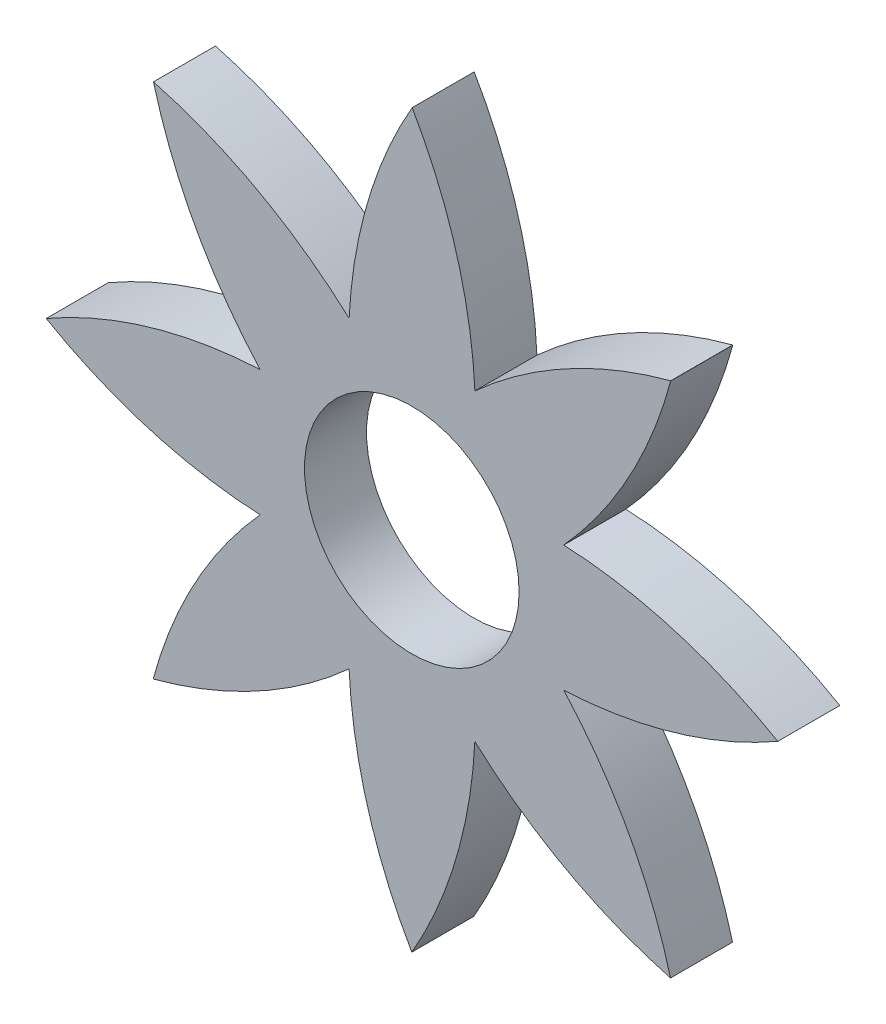
ISO-10303-21;
HEADER;
FILE_DESCRIPTION(('STEP AP214'),'2;1');
FILE_NAME('part.step','',(''),(''),'','','');
FILE_SCHEMA(('AUTOMOTIVE_DESIGN { 1 0 10303 214 1 1 1 1 }'));
ENDSEC;
DATA;
#1=APPLICATION_CONTEXT('core data for automotive mechanical design processes');
#2=APPLICATION_PROTOCOL_DEFINITION('international standard','automotive_design',2000,#1);
#3=PRODUCT_CONTEXT('',#1,'mechanical');
#4=PRODUCT('Part','Part','',(#3));
#5=PRODUCT_RELATED_PRODUCT_CATEGORY('part','',(#4));
#6=PRODUCT_DEFINITION_FORMATION('','',#4);
#7=PRODUCT_DEFINITION_CONTEXT('part definition',#1,'design');
#8=PRODUCT_DEFINITION('design','',#6,#7);
#9=PRODUCT_DEFINITION_SHAPE('','',#8);
#10=(LENGTH_UNIT() NAMED_UNIT(*) SI_UNIT(.MILLI.,.METRE.));
#11=(NAMED_UNIT(*) PLANE_ANGLE_UNIT() SI_UNIT($,.RADIAN.));
#12=(NAMED_UNIT(*) SI_UNIT($,.STERADIAN.) SOLID_ANGLE_UNIT());
#13=UNCERTAINTY_MEASURE_WITH_UNIT(LENGTH_MEASURE(1.E-05),#10,'distance_accuracy_value','');
#14=(GEOMETRIC_REPRESENTATION_CONTEXT(3) GLOBAL_UNCERTAINTY_ASSIGNED_CONTEXT((#13)) GLOBAL_UNIT_ASSIGNED_CONTEXT((#10,
#11,#12)) REPRESENTATION_CONTEXT('',''));
#15=CARTESIAN_POINT('',(0.,0.,0.));
#16=DIRECTION('',(0.,0.,1.));
#17=DIRECTION('',(1.,0.,0.));
#18=AXIS2_PLACEMENT_3D('',#15,#16,#17);
#19=CARTESIAN_POINT('',(13.1836756550632,-42.0143777364416,6.35));
#20=DIRECTION('',(0.,0.,-1.));
#21=DIRECTION('',(-1.,0.,0.));
#22=AXIS2_PLACEMENT_3D('',#19,#20,#21);
#23=CYLINDRICAL_SURFACE('',#22,48.5261851841294);
#24=CARTESIAN_POINT('',(13.1836756550632,-42.0143777364416,0.));
#25=DIRECTION('',(0.,0.,1.));
#26=DIRECTION('',(1.,0.,0.));
#27=AXIS2_PLACEMENT_3D('',#24,#25,#26);
#28=CIRCLE('',#27,48.5261851841294);
#29=CARTESIAN_POINT('',(15.5602905844267,6.45357404617399,0.));
#30=VERTEX_POINT('',#29);
#31=CARTESIAN_POINT('',(37.465,0.,0.));
#32=VERTEX_POINT('',#31);
#33=EDGE_CURVE('E192',#30,#32,#28,.F.);
#34=ORIENTED_EDGE('',*,*,#33,.F.);
#35=DIRECTION('',(0.,0.,-1.));
#36=VECTOR('',#35,1.);
#37=CARTESIAN_POINT('',(15.5602905844267,6.45357404617399,6.35));
#38=LINE('',#37,#36);
#39=CARTESIAN_POINT('',(15.5602905844267,6.45357404617399,6.35));
#40=VERTEX_POINT('',#39);
#41=EDGE_CURVE('E11',#40,#30,#38,.T.);
#42=ORIENTED_EDGE('',*,*,#41,.F.);
#43=CARTESIAN_POINT('',(13.1836756550632,-42.0143777364416,6.35));
#44=DIRECTION('',(0.,0.,1.));
#45=DIRECTION('',(1.,0.,0.));
#46=AXIS2_PLACEMENT_3D('',#43,#44,#45);
#47=CIRCLE('',#46,48.5261851841294);
#48=CARTESIAN_POINT('',(37.465,0.,6.35));
#49=VERTEX_POINT('',#48);
#50=EDGE_CURVE('E345',#40,#49,#47,.F.);
#51=ORIENTED_EDGE('',*,*,#50,.T.);
#52=DIRECTION('',(0.,0.,-1.));
#53=VECTOR('',#52,1.);
#54=CARTESIAN_POINT('',(37.465,0.,6.35));
#55=LINE('',#54,#53);
#56=EDGE_CURVE('E119',#49,#32,#55,.T.);
#57=ORIENTED_EDGE('',*,*,#56,.T.);
#58=EDGE_LOOP('',(#34,#42,#51,#57));
#59=FACE_BOUND('',#58,.T.);
#60=ADVANCED_FACE('F41',(#59),#23,.T.);
#61=CARTESIAN_POINT('',(-20.3470310174331,39.0948807587588,6.35));
#62=DIRECTION('',(0.,0.,-1.));
#63=DIRECTION('',(-1.,0.,0.));
#64=AXIS2_PLACEMENT_3D('',#61,#62,#63);
#65=CYLINDRICAL_SURFACE('',#64,48.5261851841295);
#66=CARTESIAN_POINT('',(-20.3470310174331,39.0948807587588,0.));
#67=DIRECTION('',(0.,0.,1.));
#68=DIRECTION('',(1.,0.,0.));
#69=AXIS2_PLACEMENT_3D('',#66,#67,#68);
#70=CIRCLE('',#69,48.5261851841295);
#71=CARTESIAN_POINT('',(26.5092436609007,26.4742559012901,0.));
#72=VERTEX_POINT('',#71);
#73=EDGE_CURVE('E195',#30,#72,#70,.T.);
#74=ORIENTED_EDGE('',*,*,#73,.T.);
#75=DIRECTION('',(0.,0.,-1.));
#76=VECTOR('',#75,1.);
#77=CARTESIAN_POINT('',(26.5092436609007,26.4742559012901,6.35));
#78=LINE('',#77,#76);
#79=CARTESIAN_POINT('',(26.5092436609007,26.4742559012901,6.35));
#80=VERTEX_POINT('',#79);
#81=EDGE_CURVE('E50',#80,#72,#78,.T.);
#82=ORIENTED_EDGE('',*,*,#81,.F.);
#83=CARTESIAN_POINT('',(-20.3470310174331,39.0948807587588,6.35));
#84=DIRECTION('',(0.,0.,1.));
#85=DIRECTION('',(1.,0.,0.));
#86=AXIS2_PLACEMENT_3D('',#83,#84,#85);
#87=CIRCLE('',#86,48.5261851841295);
#88=EDGE_CURVE('E347',#40,#80,#87,.T.);
#89=ORIENTED_EDGE('',*,*,#88,.F.);
#90=ORIENTED_EDGE('',*,*,#41,.T.);
#91=EDGE_LOOP('',(#74,#82,#89,#90));
#92=FACE_BOUND('',#91,.T.);
#93=ADVANCED_FACE('F273',(#92),#65,.T.);
#94=CARTESIAN_POINT('',(0.,0.,6.35));
#95=DIRECTION('',(0.,0.,-1.));
#96=DIRECTION('',(-1.,0.,0.));
#97=AXIS2_PLACEMENT_3D('',#94,#95,#96);
#98=CYLINDRICAL_SURFACE('',#97,37.465);
#99=CARTESIAN_POINT('',(0.,0.,0.));
#100=DIRECTION('',(0.,0.,1.));
#101=DIRECTION('',(1.,0.,0.));
#102=AXIS2_PLACEMENT_3D('',#99,#100,#101);
#103=CIRCLE('',#102,37.465);
#104=CARTESIAN_POINT('',(26.5025029388673,26.4810038135892,0.));
#105=VERTEX_POINT('',#104);
#106=EDGE_CURVE('E198',#72,#105,#103,.T.);
#107=ORIENTED_EDGE('',*,*,#106,.T.);
#108=DIRECTION('',(0.,0.,-1.));
#109=VECTOR('',#108,1.);
#110=CARTESIAN_POINT('',(26.5025029388673,26.4810038135892,6.35));
#111=LINE('',#110,#109);
#112=CARTESIAN_POINT('',(26.5025029388673,26.4810038135892,6.35));
#113=VERTEX_POINT('',#112);
#114=EDGE_CURVE('E263',#113,#105,#111,.T.);
#115=ORIENTED_EDGE('',*,*,#114,.F.);
#116=CARTESIAN_POINT('',(0.,0.,6.35));
#117=DIRECTION('',(0.,0.,1.));
#118=DIRECTION('',(1.,0.,0.));
#119=AXIS2_PLACEMENT_3D('',#116,#117,#118);
#120=CIRCLE('',#119,37.465);
#121=EDGE_CURVE('E269',#80,#113,#120,.T.);
#122=ORIENTED_EDGE('',*,*,#121,.F.);
#123=ORIENTED_EDGE('',*,*,#81,.T.);
#124=EDGE_LOOP('',(#107,#115,#122,#123));
#125=FACE_BOUND('',#124,.T.);
#126=ADVANCED_FACE('F267',(#125),#98,.T.);
#127=CARTESIAN_POINT('',(39.0508871958942,-20.3946689929148,6.35));
#128=DIRECTION('',(0.,0.,-1.));
#129=DIRECTION('',(-1.,0.,0.));
#130=AXIS2_PLACEMENT_3D('',#127,#128,#129);
#131=CYLINDRICAL_SURFACE('',#130,48.5261851841294);
#132=CARTESIAN_POINT('',(39.0508871958942,-20.3946689929148,0.));
#133=DIRECTION('',(0.,0.,1.));
#134=DIRECTION('',(1.,0.,0.));
#135=AXIS2_PLACEMENT_3D('',#132,#133,#134);
#136=CIRCLE('',#135,48.5261851841294);
#137=CARTESIAN_POINT('',(6.45939035300629,15.5578689156175,0.));
#138=VERTEX_POINT('',#137);
#139=EDGE_CURVE('E201',#138,#105,#136,.F.);
#140=ORIENTED_EDGE('',*,*,#139,.F.);
#141=DIRECTION('',(0.,0.,-1.));
#142=VECTOR('',#141,1.);
#143=CARTESIAN_POINT('',(6.45939035300629,15.5578689156175,6.35));
#144=LINE('',#143,#142);
#145=CARTESIAN_POINT('',(6.45939035300629,15.5578689156175,6.35));
#146=VERTEX_POINT('',#145);
#147=EDGE_CURVE('E261',#146,#138,#144,.T.);
#148=ORIENTED_EDGE('',*,*,#147,.F.);
#149=CARTESIAN_POINT('',(39.0508871958942,-20.3946689929148,6.35));
#150=DIRECTION('',(0.,0.,1.));
#151=DIRECTION('',(1.,0.,0.));
#152=AXIS2_PLACEMENT_3D('',#149,#150,#151);
#153=CIRCLE('',#152,48.5261851841294);
#154=EDGE_CURVE('E352',#146,#113,#153,.F.);
#155=ORIENTED_EDGE('',*,*,#154,.T.);
#156=ORIENTED_EDGE('',*,*,#114,.T.);
#157=EDGE_LOOP('',(#140,#148,#155,#156));
#158=FACE_BOUND('',#157,.T.);
#159=ADVANCED_FACE('F284',(#158),#131,.T.);
#160=CARTESIAN_POINT('',(-42.0118095691737,13.2484476399549,6.35));
#161=DIRECTION('',(0.,0.,-1.));
#162=DIRECTION('',(-1.,0.,0.));
#163=AXIS2_PLACEMENT_3D('',#160,#161,#162);
#164=CYLINDRICAL_SURFACE('',#163,48.5261851841295);
#165=CARTESIAN_POINT('',(-42.0118095691737,13.2484476399549,0.));
#166=DIRECTION('',(0.,0.,1.));
#167=DIRECTION('',(1.,0.,0.));
#168=AXIS2_PLACEMENT_3D('',#165,#166,#167);
#169=CIRCLE('',#168,48.5261851841295);
#170=CARTESIAN_POINT('',(0.0399474905353088,37.4649787027565,0.));
#171=VERTEX_POINT('',#170);
#172=EDGE_CURVE('E204',#138,#171,#169,.T.);
#173=ORIENTED_EDGE('',*,*,#172,.T.);
#174=DIRECTION('',(0.,0.,-1.));
#175=VECTOR('',#174,1.);
#176=CARTESIAN_POINT('',(0.0399474905353088,37.4649787027565,6.35));
#177=LINE('',#176,#175);
#178=CARTESIAN_POINT('',(0.0399474905353088,37.4649787027565,6.35));
#179=VERTEX_POINT('',#178);
#180=EDGE_CURVE('E259',#179,#171,#177,.T.);
#181=ORIENTED_EDGE('',*,*,#180,.F.);
#182=CARTESIAN_POINT('',(-42.0118095691737,13.2484476399549,6.35));
#183=DIRECTION('',(0.,0.,1.));
#184=DIRECTION('',(1.,0.,0.));
#185=AXIS2_PLACEMENT_3D('',#182,#183,#184);
#186=CIRCLE('',#185,48.5261851841295);
#187=EDGE_CURVE('E355',#146,#179,#186,.T.);
#188=ORIENTED_EDGE('',*,*,#187,.F.);
#189=ORIENTED_EDGE('',*,*,#147,.T.);
#190=EDGE_LOOP('',(#173,#181,#188,#189));
#191=FACE_BOUND('',#190,.T.);
#192=ADVANCED_FACE('F287',(#191),#164,.T.);
#193=CARTESIAN_POINT('',(42.0543252269769,13.1836543578197,6.35));
#194=DIRECTION('',(0.,0.,-1.));
#195=DIRECTION('',(-1.,0.,0.));
#196=AXIS2_PLACEMENT_3D('',#193,#194,#195);
#197=CYLINDRICAL_SURFACE('',#196,48.5261851841294);
#198=CARTESIAN_POINT('',(42.0543252269769,13.1836543578197,0.));
#199=DIRECTION('',(0.,0.,1.));
#200=DIRECTION('',(1.,0.,0.));
#201=AXIS2_PLACEMENT_3D('',#198,#199,#200);
#202=CIRCLE('',#201,48.5261851841294);
#203=CARTESIAN_POINT('',(-6.41362655563869,15.5602692871832,0.));
#204=VERTEX_POINT('',#203);
#205=EDGE_CURVE('E207',#204,#171,#202,.F.);
#206=ORIENTED_EDGE('',*,*,#205,.F.);
#207=DIRECTION('',(0.,0.,-1.));
#208=VECTOR('',#207,1.);
#209=CARTESIAN_POINT('',(-6.41362655563869,15.5602692871832,6.35));
#210=LINE('',#209,#208);
#211=CARTESIAN_POINT('',(-6.41362655563869,15.5602692871832,6.35));
#212=VERTEX_POINT('',#211);
#213=EDGE_CURVE('E257',#212,#204,#210,.T.);
#214=ORIENTED_EDGE('',*,*,#213,.F.);
#215=CARTESIAN_POINT('',(42.0543252269769,13.1836543578197,6.35));
#216=DIRECTION('',(0.,0.,1.));
#217=DIRECTION('',(1.,0.,0.));
#218=AXIS2_PLACEMENT_3D('',#215,#216,#217);
#219=CIRCLE('',#218,48.5261851841294);
#220=EDGE_CURVE('E357',#212,#179,#219,.F.);
#221=ORIENTED_EDGE('',*,*,#220,.T.);
#222=ORIENTED_EDGE('',*,*,#180,.T.);
#223=EDGE_LOOP('',(#206,#214,#221,#222));
#224=FACE_BOUND('',#223,.T.);
#225=ADVANCED_FACE('F291',(#224),#197,.T.);
#226=CARTESIAN_POINT('',(-39.0549332682235,-20.3470523146766,6.35));
#227=DIRECTION('',(0.,0.,-1.));
#228=DIRECTION('',(-1.,0.,0.));
#229=AXIS2_PLACEMENT_3D('',#226,#227,#228);
#230=CYLINDRICAL_SURFACE('',#229,48.5261851841295);
#231=CARTESIAN_POINT('',(-39.0549332682235,-20.3470523146766,0.));
#232=DIRECTION('',(0.,0.,1.));
#233=DIRECTION('',(1.,0.,0.));
#234=AXIS2_PLACEMENT_3D('',#231,#232,#233);
#235=CIRCLE('',#234,48.5261851841295);
#236=CARTESIAN_POINT('',(-26.4435240218157,26.5117035943746,0.));
#237=VERTEX_POINT('',#236);
#238=EDGE_CURVE('E210',#204,#237,#235,.T.);
#239=ORIENTED_EDGE('',*,*,#238,.T.);
#240=DIRECTION('',(0.,0.,-1.));
#241=VECTOR('',#240,1.);
#242=CARTESIAN_POINT('',(-26.4435240218157,26.5117035943746,6.35));
#243=LINE('',#242,#241);
#244=CARTESIAN_POINT('',(-26.4435240218157,26.5117035943746,6.35));
#245=VERTEX_POINT('',#244);
#246=EDGE_CURVE('E255',#245,#237,#243,.T.);
#247=ORIENTED_EDGE('',*,*,#246,.F.);
#248=CARTESIAN_POINT('',(-39.0549332682235,-20.3470523146766,6.35));
#249=DIRECTION('',(0.,0.,1.));
#250=DIRECTION('',(1.,0.,0.));
#251=AXIS2_PLACEMENT_3D('',#248,#249,#250);
#252=CIRCLE('',#251,48.5261851841295);
#253=EDGE_CURVE('E360',#212,#245,#252,.T.);
#254=ORIENTED_EDGE('',*,*,#253,.F.);
#255=ORIENTED_EDGE('',*,*,#213,.T.);
#256=EDGE_LOOP('',(#239,#247,#254,#255));
#257=FACE_BOUND('',#256,.T.);
#258=ADVANCED_FACE('F295',(#257),#230,.T.);
#259=CARTESIAN_POINT('',(20.4346164834501,39.0508658986508,6.35));
#260=DIRECTION('',(0.,0.,-1.));
#261=DIRECTION('',(-1.,0.,0.));
#262=AXIS2_PLACEMENT_3D('',#259,#260,#261);
#263=CYLINDRICAL_SURFACE('',#262,48.5261851841294);
#264=CARTESIAN_POINT('',(20.4346164834501,39.0508658986508,0.));
#265=DIRECTION('',(0.,0.,1.));
#266=DIRECTION('',(1.,0.,0.));
#267=AXIS2_PLACEMENT_3D('',#264,#265,#266);
#268=CIRCLE('',#267,48.5261851841294);
#269=CARTESIAN_POINT('',(-15.5179214250821,6.4593690557628,0.));
#270=VERTEX_POINT('',#269);
#271=EDGE_CURVE('E213',#270,#237,#268,.F.);
#272=ORIENTED_EDGE('',*,*,#271,.F.);
#273=DIRECTION('',(0.,0.,-1.));
#274=VECTOR('',#273,1.);
#275=CARTESIAN_POINT('',(-15.5179214250821,6.4593690557628,6.35));
#276=LINE('',#275,#274);
#277=CARTESIAN_POINT('',(-15.5179214250821,6.4593690557628,6.35));
#278=VERTEX_POINT('',#277);
#279=EDGE_CURVE('E253',#278,#270,#276,.T.);
#280=ORIENTED_EDGE('',*,*,#279,.F.);
#281=CARTESIAN_POINT('',(20.4346164834501,39.0508658986508,6.35));
#282=DIRECTION('',(0.,0.,1.));
#283=DIRECTION('',(1.,0.,0.));
#284=AXIS2_PLACEMENT_3D('',#281,#282,#283);
#285=CIRCLE('',#284,48.5261851841294);
#286=EDGE_CURVE('E362',#278,#245,#285,.F.);
#287=ORIENTED_EDGE('',*,*,#286,.T.);
#288=ORIENTED_EDGE('',*,*,#246,.T.);
#289=EDGE_LOOP('',(#272,#280,#287,#288));
#290=FACE_BOUND('',#289,.T.);
#291=ADVANCED_FACE('F299',(#290),#263,.T.);
#292=CARTESIAN_POINT('',(-13.2085001494195,-42.0118308664172,6.35));
#293=DIRECTION('',(0.,0.,-1.));
#294=DIRECTION('',(-1.,0.,0.));
#295=AXIS2_PLACEMENT_3D('',#292,#293,#294);
#296=CYLINDRICAL_SURFACE('',#295,48.5261851841295);
#297=CARTESIAN_POINT('',(-13.2085001494195,-42.0118308664172,0.));
#298=DIRECTION('',(0.,0.,1.));
#299=DIRECTION('',(1.,0.,0.));
#300=AXIS2_PLACEMENT_3D('',#297,#298,#299);
#301=CIRCLE('',#300,48.5261851841295);
#302=CARTESIAN_POINT('',(-37.4250312122212,0.0399261932918019,0.));
#303=VERTEX_POINT('',#302);
#304=EDGE_CURVE('E216',#270,#303,#301,.T.);
#305=ORIENTED_EDGE('',*,*,#304,.T.);
#306=DIRECTION('',(0.,0.,-1.));
#307=VECTOR('',#306,1.);
#308=CARTESIAN_POINT('',(-37.4250312122212,0.0399261932918019,6.35));
#309=LINE('',#308,#307);
#310=CARTESIAN_POINT('',(-37.4250312122212,0.0399261932918019,6.35));
#311=VERTEX_POINT('',#310);
#312=EDGE_CURVE('E251',#311,#303,#309,.T.);
#313=ORIENTED_EDGE('',*,*,#312,.F.);
#314=CARTESIAN_POINT('',(-13.2085001494195,-42.0118308664172,6.35));
#315=DIRECTION('',(0.,0.,1.));
#316=DIRECTION('',(1.,0.,0.));
#317=AXIS2_PLACEMENT_3D('',#314,#315,#316);
#318=CIRCLE('',#317,48.5261851841295);
#319=EDGE_CURVE('E365',#278,#311,#318,.T.);
#320=ORIENTED_EDGE('',*,*,#319,.F.);
#321=ORIENTED_EDGE('',*,*,#279,.T.);
#322=EDGE_LOOP('',(#305,#313,#320,#321));
#323=FACE_BOUND('',#322,.T.);
#324=ADVANCED_FACE('F303',(#323),#296,.T.);
#325=CARTESIAN_POINT('',(-13.1437068672844,42.0543039297334,6.35));
#326=DIRECTION('',(0.,0.,-1.));
#327=DIRECTION('',(-1.,0.,0.));
#328=AXIS2_PLACEMENT_3D('',#325,#326,#327);
#329=CYLINDRICAL_SURFACE('',#328,48.5261851841294);
#330=CARTESIAN_POINT('',(-13.1437068672844,42.0543039297334,0.));
#331=DIRECTION('',(0.,0.,1.));
#332=DIRECTION('',(1.,0.,0.));
#333=AXIS2_PLACEMENT_3D('',#330,#331,#332);
#334=CIRCLE('',#333,48.5261851841294);
#335=CARTESIAN_POINT('',(-15.5203217966479,-6.41364785288218,0.));
#336=VERTEX_POINT('',#335);
#337=EDGE_CURVE('E219',#336,#303,#334,.F.);
#338=ORIENTED_EDGE('',*,*,#337,.F.);
#339=DIRECTION('',(0.,0.,-1.));
#340=VECTOR('',#339,1.);
#341=CARTESIAN_POINT('',(-15.5203217966479,-6.41364785288218,6.35));
#342=LINE('',#341,#340);
#343=CARTESIAN_POINT('',(-15.5203217966479,-6.41364785288218,6.35));
#344=VERTEX_POINT('',#343);
#345=EDGE_CURVE('E249',#344,#336,#342,.T.);
#346=ORIENTED_EDGE('',*,*,#345,.F.);
#347=CARTESIAN_POINT('',(-13.1437068672844,42.0543039297334,6.35));
#348=DIRECTION('',(0.,0.,1.));
#349=DIRECTION('',(1.,0.,0.));
#350=AXIS2_PLACEMENT_3D('',#347,#348,#349);
#351=CIRCLE('',#350,48.5261851841294);
#352=EDGE_CURVE('E367',#344,#311,#351,.F.);
#353=ORIENTED_EDGE('',*,*,#352,.T.);
#354=ORIENTED_EDGE('',*,*,#312,.T.);
#355=EDGE_LOOP('',(#338,#346,#353,#354));
#356=FACE_BOUND('',#355,.T.);
#357=ADVANCED_FACE('F307',(#356),#329,.T.);
#358=CARTESIAN_POINT('',(20.386999805212,-39.054954565467,6.35));
#359=DIRECTION('',(0.,0.,-1.));
#360=DIRECTION('',(-1.,0.,0.));
#361=AXIS2_PLACEMENT_3D('',#358,#359,#360);
#362=CYLINDRICAL_SURFACE('',#361,48.5261851841295);
#363=CARTESIAN_POINT('',(20.386999805212,-39.054954565467,0.));
#364=DIRECTION('',(0.,0.,1.));
#365=DIRECTION('',(1.,0.,0.));
#366=AXIS2_PLACEMENT_3D('',#363,#364,#365);
#367=CIRCLE('',#366,48.5261851841295);
#368=CARTESIAN_POINT('',(-26.4717561038393,-26.4435453190592,0.));
#369=VERTEX_POINT('',#368);
#370=EDGE_CURVE('E222',#336,#369,#367,.T.);
#371=ORIENTED_EDGE('',*,*,#370,.T.);
#372=DIRECTION('',(0.,0.,-1.));
#373=VECTOR('',#372,1.);
#374=CARTESIAN_POINT('',(-26.4717561038393,-26.4435453190592,6.35));
#375=LINE('',#374,#373);
#376=CARTESIAN_POINT('',(-26.4717561038393,-26.4435453190592,6.35));
#377=VERTEX_POINT('',#376);
#378=EDGE_CURVE('E247',#377,#369,#375,.T.);
#379=ORIENTED_EDGE('',*,*,#378,.F.);
#380=CARTESIAN_POINT('',(20.386999805212,-39.054954565467,6.35));
#381=DIRECTION('',(0.,0.,1.));
#382=DIRECTION('',(1.,0.,0.));
#383=AXIS2_PLACEMENT_3D('',#380,#381,#382);
#384=CIRCLE('',#383,48.5261851841295);
#385=EDGE_CURVE('E370',#344,#377,#384,.T.);
#386=ORIENTED_EDGE('',*,*,#385,.F.);
#387=ORIENTED_EDGE('',*,*,#345,.T.);
#388=EDGE_LOOP('',(#371,#379,#386,#387));
#389=FACE_BOUND('',#388,.T.);
#390=ADVANCED_FACE('F311',(#389),#362,.T.);
#391=CARTESIAN_POINT('',(-39.0109184081154,20.4345951862066,6.35));
#392=DIRECTION('',(0.,0.,-1.));
#393=DIRECTION('',(-1.,0.,0.));
#394=AXIS2_PLACEMENT_3D('',#391,#392,#393);
#395=CYLINDRICAL_SURFACE('',#394,48.5261851841294);
#396=CARTESIAN_POINT('',(-39.0109184081154,20.4345951862066,0.));
#397=DIRECTION('',(0.,0.,1.));
#398=DIRECTION('',(1.,0.,0.));
#399=AXIS2_PLACEMENT_3D('',#396,#397,#398);
#400=CIRCLE('',#399,48.5261851841294);
#401=CARTESIAN_POINT('',(-6.41942156522748,-15.5179427223256,0.));
#402=VERTEX_POINT('',#401);
#403=EDGE_CURVE('E225',#402,#369,#400,.F.);
#404=ORIENTED_EDGE('',*,*,#403,.F.);
#405=DIRECTION('',(0.,0.,-1.));
#406=VECTOR('',#405,1.);
#407=CARTESIAN_POINT('',(-6.41942156522748,-15.5179427223256,6.35));
#408=LINE('',#407,#406);
#409=CARTESIAN_POINT('',(-6.41942156522748,-15.5179427223256,6.35));
#410=VERTEX_POINT('',#409);
#411=EDGE_CURVE('E245',#410,#402,#408,.T.);
#412=ORIENTED_EDGE('',*,*,#411,.F.);
#413=CARTESIAN_POINT('',(-39.0109184081154,20.4345951862066,6.35));
#414=DIRECTION('',(0.,0.,1.));
#415=DIRECTION('',(1.,0.,0.));
#416=AXIS2_PLACEMENT_3D('',#413,#414,#415);
#417=CIRCLE('',#416,48.5261851841294);
#418=EDGE_CURVE('E372',#410,#377,#417,.F.);
#419=ORIENTED_EDGE('',*,*,#418,.T.);
#420=ORIENTED_EDGE('',*,*,#378,.T.);
#421=EDGE_LOOP('',(#404,#412,#419,#420));
#422=FACE_BOUND('',#421,.T.);
#423=ADVANCED_FACE('F315',(#422),#395,.T.);
#424=CARTESIAN_POINT('',(42.0517783569525,-13.208521446663,6.35));
#425=DIRECTION('',(0.,0.,-1.));
#426=DIRECTION('',(-1.,0.,0.));
#427=AXIS2_PLACEMENT_3D('',#424,#425,#426);
#428=CYLINDRICAL_SURFACE('',#427,48.5261851841295);
#429=CARTESIAN_POINT('',(42.0517783569525,-13.208521446663,0.));
#430=DIRECTION('',(0.,0.,1.));
#431=DIRECTION('',(1.,0.,0.));
#432=AXIS2_PLACEMENT_3D('',#429,#430,#431);
#433=CIRCLE('',#432,48.5261851841295);
#434=CARTESIAN_POINT('',(2.12972435104097E-05,-37.4250525094646,0.));
#435=VERTEX_POINT('',#434);
#436=EDGE_CURVE('E228',#402,#435,#433,.T.);
#437=ORIENTED_EDGE('',*,*,#436,.T.);
#438=DIRECTION('',(0.,0.,-1.));
#439=VECTOR('',#438,1.);
#440=CARTESIAN_POINT('',(2.12972435104097E-05,-37.4250525094646,6.35));
#441=LINE('',#440,#439);
#442=CARTESIAN_POINT('',(2.12972435104097E-05,-37.4250525094646,6.35));
#443=VERTEX_POINT('',#442);
#444=EDGE_CURVE('E243',#443,#435,#441,.T.);
#445=ORIENTED_EDGE('',*,*,#444,.F.);
#446=CARTESIAN_POINT('',(42.0517783569525,-13.208521446663,6.35));
#447=DIRECTION('',(0.,0.,1.));
#448=DIRECTION('',(1.,0.,0.));
#449=AXIS2_PLACEMENT_3D('',#446,#447,#448);
#450=CIRCLE('',#449,48.5261851841295);
#451=EDGE_CURVE('E375',#410,#443,#450,.T.);
#452=ORIENTED_EDGE('',*,*,#451,.F.);
#453=ORIENTED_EDGE('',*,*,#411,.T.);
#454=EDGE_LOOP('',(#437,#445,#452,#453));
#455=FACE_BOUND('',#454,.T.);
#456=ADVANCED_FACE('F319',(#455),#428,.T.);
#457=CARTESIAN_POINT('',(-42.0143564391981,-13.1437281645278,6.35));
#458=DIRECTION('',(0.,0.,-1.));
#459=DIRECTION('',(-1.,0.,0.));
#460=AXIS2_PLACEMENT_3D('',#457,#458,#459);
#461=CYLINDRICAL_SURFACE('',#460,48.5261851841294);
#462=CARTESIAN_POINT('',(-42.0143564391981,-13.1437281645278,0.));
#463=DIRECTION('',(0.,0.,1.));
#464=DIRECTION('',(1.,0.,0.));
#465=AXIS2_PLACEMENT_3D('',#462,#463,#464);
#466=CIRCLE('',#465,48.5261851841294);
#467=CARTESIAN_POINT('',(6.45359534341747,-15.5203430938914,0.));
#468=VERTEX_POINT('',#467);
#469=EDGE_CURVE('E231',#468,#435,#466,.F.);
#470=ORIENTED_EDGE('',*,*,#469,.F.);
#471=DIRECTION('',(0.,0.,-1.));
#472=VECTOR('',#471,1.);
#473=CARTESIAN_POINT('',(6.45359534341747,-15.5203430938914,6.35));
#474=LINE('',#473,#472);
#475=CARTESIAN_POINT('',(6.45359534341747,-15.5203430938914,6.35));
#476=VERTEX_POINT('',#475);
#477=EDGE_CURVE('E182',#476,#468,#474,.T.);
#478=ORIENTED_EDGE('',*,*,#477,.F.);
#479=CARTESIAN_POINT('',(-42.0143564391981,-13.1437281645278,6.35));
#480=DIRECTION('',(0.,0.,1.));
#481=DIRECTION('',(1.,0.,0.));
#482=AXIS2_PLACEMENT_3D('',#479,#480,#481);
#483=CIRCLE('',#482,48.5261851841294);
#484=EDGE_CURVE('E171',#476,#443,#483,.F.);
#485=ORIENTED_EDGE('',*,*,#484,.T.);
#486=ORIENTED_EDGE('',*,*,#444,.T.);
#487=EDGE_LOOP('',(#470,#478,#485,#486));
#488=FACE_BOUND('',#487,.T.);
#489=ADVANCED_FACE('F323',(#488),#461,.T.);
#490=CARTESIAN_POINT('',(39.0949020560023,20.3869785079685,6.35));
#491=DIRECTION('',(0.,0.,-1.));
#492=DIRECTION('',(-1.,0.,0.));
#493=AXIS2_PLACEMENT_3D('',#490,#491,#492);
#494=CYLINDRICAL_SURFACE('',#493,48.5261851841295);
#495=CARTESIAN_POINT('',(39.0949020560023,20.3869785079685,0.));
#496=DIRECTION('',(0.,0.,1.));
#497=DIRECTION('',(1.,0.,0.));
#498=AXIS2_PLACEMENT_3D('',#495,#496,#497);
#499=CIRCLE('',#498,48.5261851841295);
#500=CARTESIAN_POINT('',(26.4834928095945,-26.4717774010828,0.));
#501=VERTEX_POINT('',#500);
#502=EDGE_CURVE('E178',#468,#501,#499,.T.);
#503=ORIENTED_EDGE('',*,*,#502,.T.);
#504=DIRECTION('',(0.,0.,-1.));
#505=VECTOR('',#504,1.);
#506=CARTESIAN_POINT('',(26.4834928095945,-26.4717774010828,6.35));
#507=LINE('',#506,#505);
#508=CARTESIAN_POINT('',(26.4834928095945,-26.4717774010828,6.35));
#509=VERTEX_POINT('',#508);
#510=EDGE_CURVE('E175',#509,#501,#507,.T.);
#511=ORIENTED_EDGE('',*,*,#510,.F.);
#512=CARTESIAN_POINT('',(39.0949020560023,20.3869785079685,6.35));
#513=DIRECTION('',(0.,0.,1.));
#514=DIRECTION('',(1.,0.,0.));
#515=AXIS2_PLACEMENT_3D('',#512,#513,#514);
#516=CIRCLE('',#515,48.5261851841295);
#517=EDGE_CURVE('E165',#476,#509,#516,.T.);
#518=ORIENTED_EDGE('',*,*,#517,.F.);
#519=ORIENTED_EDGE('',*,*,#477,.T.);
#520=EDGE_LOOP('',(#503,#511,#518,#519));
#521=FACE_BOUND('',#520,.T.);
#522=ADVANCED_FACE('F176',(#521),#494,.T.);
#523=CARTESIAN_POINT('',(-20.3946476956713,-39.0109397053589,6.35));
#524=DIRECTION('',(0.,0.,-1.));
#525=DIRECTION('',(-1.,0.,0.));
#526=AXIS2_PLACEMENT_3D('',#523,#524,#525);
#527=CYLINDRICAL_SURFACE('',#526,48.5261851841294);
#528=CARTESIAN_POINT('',(-20.3946476956713,-39.0109397053589,0.));
#529=DIRECTION('',(0.,0.,1.));
#530=DIRECTION('',(1.,0.,0.));
#531=AXIS2_PLACEMENT_3D('',#528,#529,#530);
#532=CIRCLE('',#531,48.5261851841294);
#533=CARTESIAN_POINT('',(15.557890212861,-6.41944286247095,0.));
#534=VERTEX_POINT('',#533);
#535=EDGE_CURVE('E235',#534,#501,#532,.F.);
#536=ORIENTED_EDGE('',*,*,#535,.F.);
#537=DIRECTION('',(0.,0.,-1.));
#538=VECTOR('',#537,1.);
#539=CARTESIAN_POINT('',(15.557890212861,-6.41944286247095,6.35));
#540=LINE('',#539,#538);
#541=CARTESIAN_POINT('',(15.557890212861,-6.41944286247095,6.35));
#542=VERTEX_POINT('',#541);
#543=EDGE_CURVE('E112',#542,#534,#540,.T.);
#544=ORIENTED_EDGE('',*,*,#543,.F.);
#545=CARTESIAN_POINT('',(-20.3946476956713,-39.0109397053589,6.35));
#546=DIRECTION('',(0.,0.,1.));
#547=DIRECTION('',(1.,0.,0.));
#548=AXIS2_PLACEMENT_3D('',#545,#546,#547);
#549=CIRCLE('',#548,48.5261851841294);
#550=EDGE_CURVE('E169',#542,#509,#549,.F.);
#551=ORIENTED_EDGE('',*,*,#550,.T.);
#552=ORIENTED_EDGE('',*,*,#510,.T.);
#553=EDGE_LOOP('',(#536,#544,#551,#552));
#554=FACE_BOUND('',#553,.T.);
#555=ADVANCED_FACE('F184',(#554),#527,.T.);
#556=CARTESIAN_POINT('',(0.,0.,6.35));
#557=DIRECTION('',(0.,0.,-1.));
#558=DIRECTION('',(-1.,0.,0.));
#559=AXIS2_PLACEMENT_3D('',#556,#557,#558);
#560=CYLINDRICAL_SURFACE('',#559,10.9855);
#561=CARTESIAN_POINT('',(0.,0.,6.35));
#562=DIRECTION('',(0.,0.,1.));
#563=DIRECTION('',(1.,0.,0.));
#564=AXIS2_PLACEMENT_3D('',#561,#562,#563);
#565=CIRCLE('',#564,10.9855);
#566=CARTESIAN_POINT('',(10.9855,0.,6.35));
#567=VERTEX_POINT('',#566);
#568=EDGE_CURVE('E239',#567,#567,#565,.T.);
#569=ORIENTED_EDGE('',*,*,#568,.T.);
#570=EDGE_LOOP('',(#569));
#571=FACE_BOUND('',#570,.T.);
#572=CARTESIAN_POINT('',(0.,0.,0.));
#573=DIRECTION('',(0.,0.,1.));
#574=DIRECTION('',(1.,0.,0.));
#575=AXIS2_PLACEMENT_3D('',#572,#573,#574);
#576=CIRCLE('',#575,10.9855);
#577=CARTESIAN_POINT('',(10.9855,0.,0.));
#578=VERTEX_POINT('',#577);
#579=EDGE_CURVE('E189',#578,#578,#576,.T.);
#580=ORIENTED_EDGE('',*,*,#579,.F.);
#581=EDGE_LOOP('',(#580));
#582=FACE_BOUND('',#581,.T.);
#583=ADVANCED_FACE('F43',(#571,#582),#560,.F.);
#584=CARTESIAN_POINT('',(13.2484689371984,42.0517570597091,6.35));
#585=DIRECTION('',(0.,0.,-1.));
#586=DIRECTION('',(-1.,0.,0.));
#587=AXIS2_PLACEMENT_3D('',#584,#585,#586);
#588=CYLINDRICAL_SURFACE('',#587,48.5261851841295);
#589=CARTESIAN_POINT('',(13.2484689371984,42.0517570597091,0.));
#590=DIRECTION('',(0.,0.,1.));
#591=DIRECTION('',(1.,0.,0.));
#592=AXIS2_PLACEMENT_3D('',#589,#590,#591);
#593=CIRCLE('',#592,48.5261851841295);
#594=EDGE_CURVE('E237',#534,#32,#593,.T.);
#595=ORIENTED_EDGE('',*,*,#594,.T.);
#596=ORIENTED_EDGE('',*,*,#56,.F.);
#597=CARTESIAN_POINT('',(13.2484689371984,42.0517570597091,6.35));
#598=DIRECTION('',(0.,0.,1.));
#599=DIRECTION('',(1.,0.,0.));
#600=AXIS2_PLACEMENT_3D('',#597,#598,#599);
#601=CIRCLE('',#600,48.5261851841295);
#602=EDGE_CURVE('E58',#542,#49,#601,.T.);
#603=ORIENTED_EDGE('',*,*,#602,.F.);
#604=ORIENTED_EDGE('',*,*,#543,.T.);
#605=EDGE_LOOP('',(#595,#596,#603,#604));
#606=FACE_BOUND('',#605,.T.);
#607=ADVANCED_FACE('F332',(#606),#588,.T.);
#608=CARTESIAN_POINT('',(0.,0.,6.35));
#609=DIRECTION('',(0.,0.,1.));
#610=DIRECTION('',(1.,0.,0.));
#611=AXIS2_PLACEMENT_3D('',#608,#609,#610);
#612=PLANE('',#611);
#613=ORIENTED_EDGE('',*,*,#568,.F.);
#614=EDGE_LOOP('',(#613));
#615=FACE_BOUND('',#614,.T.);
#616=ORIENTED_EDGE('',*,*,#50,.F.);
#617=ORIENTED_EDGE('',*,*,#88,.T.);
#618=ORIENTED_EDGE('',*,*,#121,.T.);
#619=ORIENTED_EDGE('',*,*,#154,.F.);
#620=ORIENTED_EDGE('',*,*,#187,.T.);
#621=ORIENTED_EDGE('',*,*,#220,.F.);
#622=ORIENTED_EDGE('',*,*,#253,.T.);
#623=ORIENTED_EDGE('',*,*,#286,.F.);
#624=ORIENTED_EDGE('',*,*,#319,.T.);
#625=ORIENTED_EDGE('',*,*,#352,.F.);
#626=ORIENTED_EDGE('',*,*,#385,.T.);
#627=ORIENTED_EDGE('',*,*,#418,.F.);
#628=ORIENTED_EDGE('',*,*,#451,.T.);
#629=ORIENTED_EDGE('',*,*,#484,.F.);
#630=ORIENTED_EDGE('',*,*,#517,.T.);
#631=ORIENTED_EDGE('',*,*,#550,.F.);
#632=ORIENTED_EDGE('',*,*,#602,.T.);
#633=EDGE_LOOP('',(#616,#617,#618,#619,#620,#621,#622,#623,#624,#625,#626,#627,#628,#629,#630,
#631,#632));
#634=FACE_BOUND('',#633,.T.);
#635=ADVANCED_FACE('F167',(#615,#634),#612,.T.);
#636=CARTESIAN_POINT('',(0.,0.,0.));
#637=DIRECTION('',(0.,0.,1.));
#638=DIRECTION('',(1.,0.,0.));
#639=AXIS2_PLACEMENT_3D('',#636,#637,#638);
#640=PLANE('',#639);
#641=ORIENTED_EDGE('',*,*,#579,.T.);
#642=EDGE_LOOP('',(#641));
#643=FACE_BOUND('',#642,.T.);
#644=ORIENTED_EDGE('',*,*,#33,.T.);
#645=ORIENTED_EDGE('',*,*,#594,.F.);
#646=ORIENTED_EDGE('',*,*,#535,.T.);
#647=ORIENTED_EDGE('',*,*,#502,.F.);
#648=ORIENTED_EDGE('',*,*,#469,.T.);
#649=ORIENTED_EDGE('',*,*,#436,.F.);
#650=ORIENTED_EDGE('',*,*,#403,.T.);
#651=ORIENTED_EDGE('',*,*,#370,.F.);
#652=ORIENTED_EDGE('',*,*,#337,.T.);
#653=ORIENTED_EDGE('',*,*,#304,.F.);
#654=ORIENTED_EDGE('',*,*,#271,.T.);
#655=ORIENTED_EDGE('',*,*,#238,.F.);
#656=ORIENTED_EDGE('',*,*,#205,.T.);
#657=ORIENTED_EDGE('',*,*,#172,.F.);
#658=ORIENTED_EDGE('',*,*,#139,.T.);
#659=ORIENTED_EDGE('',*,*,#106,.F.);
#660=ORIENTED_EDGE('',*,*,#73,.F.);
#661=EDGE_LOOP('',(#644,#645,#646,#647,#648,#649,#650,#651,#652,#653,#654,#655,#656,#657,#658,
#659,#660));
#662=FACE_BOUND('',#661,.T.);
#663=ADVANCED_FACE('F275',(#643,#662),#640,.F.);
#664=CLOSED_SHELL('',(#60,#93,#126,#159,#192,#225,#258,#291,#324,#357,#390,#423,#456,#489,#522,
#555,#583,#607,#635,#663));
#665=MANIFOLD_SOLID_BREP('B2',#664);
#666=ADVANCED_BREP_SHAPE_REPRESENTATION('',(#18,#665),#14);
#667=SHAPE_DEFINITION_REPRESENTATION(#9,#666);
ENDSEC;
END-ISO-10303-21;
